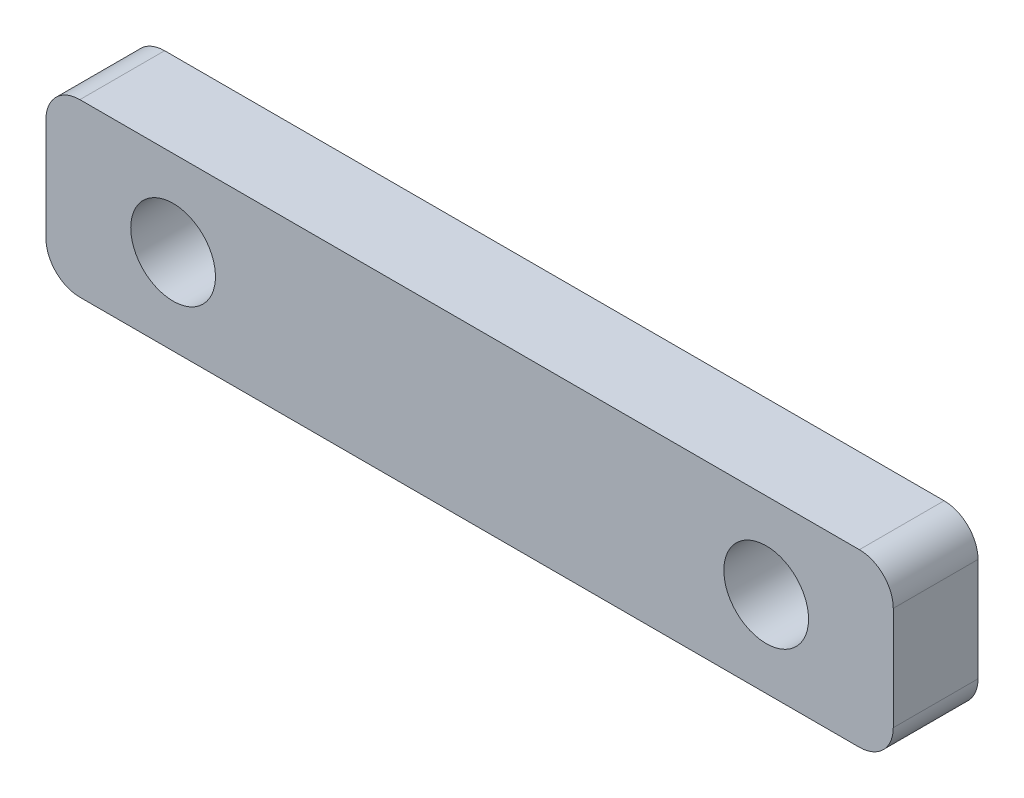
ISO-10303-21;
HEADER;
FILE_DESCRIPTION(('STEP AP214'),'2;1');
FILE_NAME('part.step','',(''),(''),'','','');
FILE_SCHEMA(('AUTOMOTIVE_DESIGN { 1 0 10303 214 1 1 1 1 }'));
ENDSEC;
DATA;
#1=APPLICATION_CONTEXT('core data for automotive mechanical design processes');
#2=APPLICATION_PROTOCOL_DEFINITION('international standard','automotive_design',2000,#1);
#3=PRODUCT_CONTEXT('',#1,'mechanical');
#4=PRODUCT('Part','Part','',(#3));
#5=PRODUCT_RELATED_PRODUCT_CATEGORY('part','',(#4));
#6=PRODUCT_DEFINITION_FORMATION('','',#4);
#7=PRODUCT_DEFINITION_CONTEXT('part definition',#1,'design');
#8=PRODUCT_DEFINITION('design','',#6,#7);
#9=PRODUCT_DEFINITION_SHAPE('','',#8);
#10=(LENGTH_UNIT() NAMED_UNIT(*) SI_UNIT(.MILLI.,.METRE.));
#11=(NAMED_UNIT(*) PLANE_ANGLE_UNIT() SI_UNIT($,.RADIAN.));
#12=(NAMED_UNIT(*) SI_UNIT($,.STERADIAN.) SOLID_ANGLE_UNIT());
#13=UNCERTAINTY_MEASURE_WITH_UNIT(LENGTH_MEASURE(1.E-05),#10,'distance_accuracy_value','');
#14=(GEOMETRIC_REPRESENTATION_CONTEXT(3) GLOBAL_UNCERTAINTY_ASSIGNED_CONTEXT((#13)) GLOBAL_UNIT_ASSIGNED_CONTEXT((#10,
#11,#12)) REPRESENTATION_CONTEXT('',''));
#15=CARTESIAN_POINT('',(0.,0.,0.));
#16=DIRECTION('',(0.,0.,1.));
#17=DIRECTION('',(1.,0.,0.));
#18=AXIS2_PLACEMENT_3D('',#15,#16,#17);
#19=CARTESIAN_POINT('',(34.5443338450992,5.89447236180904,5.));
#20=DIRECTION('',(0.,0.,1.));
#21=DIRECTION('',(1.,0.,0.));
#22=AXIS2_PLACEMENT_3D('',#19,#20,#21);
#23=PLANE('',#22);
#24=CARTESIAN_POINT('',(29.0443338450992,8.94447236180905,5.));
#25=DIRECTION('',(0.,0.,1.));
#26=DIRECTION('',(1.,0.,0.));
#27=AXIS2_PLACEMENT_3D('',#24,#25,#26);
#28=CIRCLE('',#27,2.5);
#29=CARTESIAN_POINT('',(31.5443338450992,8.94447236180905,5.));
#30=VERTEX_POINT('',#29);
#31=EDGE_CURVE('E140',#30,#30,#28,.T.);
#32=ORIENTED_EDGE('',*,*,#31,.F.);
#33=EDGE_LOOP('',(#32));
#34=FACE_BOUND('',#33,.T.);
#35=CARTESIAN_POINT('',(34.5443338450992,5.89447236180904,5.));
#36=DIRECTION('',(0.,0.,1.));
#37=DIRECTION('',(1.,0.,0.));
#38=AXIS2_PLACEMENT_3D('',#35,#36,#37);
#39=CIRCLE('',#38,2.);
#40=CARTESIAN_POINT('',(34.5443338450992,3.89447236180904,5.));
#41=VERTEX_POINT('',#40);
#42=CARTESIAN_POINT('',(36.5443338450992,5.89447236180906,5.));
#43=VERTEX_POINT('',#42);
#44=EDGE_CURVE('E151',#41,#43,#39,.T.);
#45=ORIENTED_EDGE('',*,*,#44,.T.);
#46=DIRECTION('',(0.,1.,0.));
#47=VECTOR('',#46,1.);
#48=CARTESIAN_POINT('',(36.5443338450992,11.994472361809,5.));
#49=LINE('',#48,#47);
#50=CARTESIAN_POINT('',(36.5443338450992,11.994472361809,5.));
#51=VERTEX_POINT('',#50);
#52=EDGE_CURVE('E99',#43,#51,#49,.T.);
#53=ORIENTED_EDGE('',*,*,#52,.T.);
#54=CARTESIAN_POINT('',(34.5443338450992,11.994472361809,5.));
#55=DIRECTION('',(0.,0.,1.));
#56=DIRECTION('',(1.,0.,0.));
#57=AXIS2_PLACEMENT_3D('',#54,#55,#56);
#58=CIRCLE('',#57,2.);
#59=CARTESIAN_POINT('',(34.5443338450992,13.994472361809,5.));
#60=VERTEX_POINT('',#59);
#61=EDGE_CURVE('E166',#51,#60,#58,.T.);
#62=ORIENTED_EDGE('',*,*,#61,.T.);
#63=DIRECTION('',(-1.,0.,0.));
#64=VECTOR('',#63,1.);
#65=CARTESIAN_POINT('',(-11.4556661549007,13.994472361809,5.));
#66=LINE('',#65,#64);
#67=CARTESIAN_POINT('',(-11.4556661549007,13.994472361809,5.));
#68=VERTEX_POINT('',#67);
#69=EDGE_CURVE('E179',#60,#68,#66,.T.);
#70=ORIENTED_EDGE('',*,*,#69,.T.);
#71=CARTESIAN_POINT('',(-11.4556661549008,11.994472361809,5.));
#72=DIRECTION('',(0.,0.,1.));
#73=DIRECTION('',(-1.,0.,0.));
#74=AXIS2_PLACEMENT_3D('',#71,#72,#73);
#75=CIRCLE('',#74,2.);
#76=CARTESIAN_POINT('',(-13.4556661549008,11.994472361809,5.));
#77=VERTEX_POINT('',#76);
#78=EDGE_CURVE('E118',#68,#77,#75,.T.);
#79=ORIENTED_EDGE('',*,*,#78,.T.);
#80=DIRECTION('',(0.,-1.,0.));
#81=VECTOR('',#80,1.);
#82=CARTESIAN_POINT('',(-13.4556661549008,11.994472361809,5.));
#83=LINE('',#82,#81);
#84=CARTESIAN_POINT('',(-13.4556661549008,5.89447236180904,5.));
#85=VERTEX_POINT('',#84);
#86=EDGE_CURVE('E112',#77,#85,#83,.T.);
#87=ORIENTED_EDGE('',*,*,#86,.T.);
#88=CARTESIAN_POINT('',(-11.4556661549008,5.89447236180904,5.));
#89=DIRECTION('',(0.,0.,1.));
#90=DIRECTION('',(-1.,0.,0.));
#91=AXIS2_PLACEMENT_3D('',#88,#89,#90);
#92=CIRCLE('',#91,2.);
#93=CARTESIAN_POINT('',(-11.4556661549007,3.89447236180904,5.));
#94=VERTEX_POINT('',#93);
#95=EDGE_CURVE('E116',#85,#94,#92,.T.);
#96=ORIENTED_EDGE('',*,*,#95,.T.);
#97=DIRECTION('',(1.,0.,0.));
#98=VECTOR('',#97,1.);
#99=CARTESIAN_POINT('',(-11.4556661549007,3.89447236180904,5.));
#100=LINE('',#99,#98);
#101=EDGE_CURVE('E56',#94,#41,#100,.T.);
#102=ORIENTED_EDGE('',*,*,#101,.T.);
#103=EDGE_LOOP('',(#45,#53,#62,#70,#79,#87,#96,#102));
#104=FACE_BOUND('',#103,.T.);
#105=CARTESIAN_POINT('',(-5.95566615490074,8.94447236180905,5.));
#106=DIRECTION('',(0.,0.,1.));
#107=DIRECTION('',(-1.,0.,0.));
#108=AXIS2_PLACEMENT_3D('',#105,#106,#107);
#109=CIRCLE('',#108,2.5);
#110=CARTESIAN_POINT('',(-8.45566615490075,8.94447236180905,5.));
#111=VERTEX_POINT('',#110);
#112=EDGE_CURVE('E188',#111,#111,#109,.T.);
#113=ORIENTED_EDGE('',*,*,#112,.F.);
#114=EDGE_LOOP('',(#113));
#115=FACE_BOUND('',#114,.T.);
#116=ADVANCED_FACE('F39',(#34,#104,#115),#23,.T.);
#117=CARTESIAN_POINT('',(34.5443338450992,5.89447236180904,0.));
#118=DIRECTION('',(0.,0.,1.));
#119=DIRECTION('',(1.,0.,0.));
#120=AXIS2_PLACEMENT_3D('',#117,#118,#119);
#121=PLANE('',#120);
#122=CARTESIAN_POINT('',(34.5443338450992,5.89447236180904,0.));
#123=DIRECTION('',(0.,0.,1.));
#124=DIRECTION('',(1.,0.,0.));
#125=AXIS2_PLACEMENT_3D('',#122,#123,#124);
#126=CIRCLE('',#125,2.);
#127=CARTESIAN_POINT('',(34.5443338450992,3.89447236180904,0.));
#128=VERTEX_POINT('',#127);
#129=CARTESIAN_POINT('',(36.5443338450992,5.89447236180906,0.));
#130=VERTEX_POINT('',#129);
#131=EDGE_CURVE('E136',#128,#130,#126,.T.);
#132=ORIENTED_EDGE('',*,*,#131,.F.);
#133=DIRECTION('',(1.,0.,0.));
#134=VECTOR('',#133,1.);
#135=CARTESIAN_POINT('',(-11.4556661549007,3.89447236180904,0.));
#136=LINE('',#135,#134);
#137=CARTESIAN_POINT('',(-11.4556661549007,3.89447236180904,0.));
#138=VERTEX_POINT('',#137);
#139=EDGE_CURVE('E91',#138,#128,#136,.T.);
#140=ORIENTED_EDGE('',*,*,#139,.F.);
#141=CARTESIAN_POINT('',(-11.4556661549008,5.89447236180904,0.));
#142=DIRECTION('',(0.,0.,1.));
#143=DIRECTION('',(-1.,0.,0.));
#144=AXIS2_PLACEMENT_3D('',#141,#142,#143);
#145=CIRCLE('',#144,2.);
#146=CARTESIAN_POINT('',(-13.4556661549008,5.89447236180904,0.));
#147=VERTEX_POINT('',#146);
#148=EDGE_CURVE('E85',#147,#138,#145,.T.);
#149=ORIENTED_EDGE('',*,*,#148,.F.);
#150=DIRECTION('',(0.,-1.,0.));
#151=VECTOR('',#150,1.);
#152=CARTESIAN_POINT('',(-13.4556661549008,11.994472361809,0.));
#153=LINE('',#152,#151);
#154=CARTESIAN_POINT('',(-13.4556661549008,11.994472361809,0.));
#155=VERTEX_POINT('',#154);
#156=EDGE_CURVE('E126',#155,#147,#153,.T.);
#157=ORIENTED_EDGE('',*,*,#156,.F.);
#158=CARTESIAN_POINT('',(-11.4556661549008,11.994472361809,0.));
#159=DIRECTION('',(0.,0.,1.));
#160=DIRECTION('',(-1.,0.,0.));
#161=AXIS2_PLACEMENT_3D('',#158,#159,#160);
#162=CIRCLE('',#161,2.);
#163=CARTESIAN_POINT('',(-11.4556661549007,13.994472361809,0.));
#164=VERTEX_POINT('',#163);
#165=EDGE_CURVE('E146',#164,#155,#162,.T.);
#166=ORIENTED_EDGE('',*,*,#165,.F.);
#167=DIRECTION('',(-1.,0.,0.));
#168=VECTOR('',#167,1.);
#169=CARTESIAN_POINT('',(-11.4556661549007,13.994472361809,0.));
#170=LINE('',#169,#168);
#171=CARTESIAN_POINT('',(34.5443338450992,13.994472361809,0.));
#172=VERTEX_POINT('',#171);
#173=EDGE_CURVE('E144',#172,#164,#170,.T.);
#174=ORIENTED_EDGE('',*,*,#173,.F.);
#175=CARTESIAN_POINT('',(34.5443338450992,11.994472361809,0.));
#176=DIRECTION('',(0.,0.,1.));
#177=DIRECTION('',(1.,0.,0.));
#178=AXIS2_PLACEMENT_3D('',#175,#176,#177);
#179=CIRCLE('',#178,2.);
#180=CARTESIAN_POINT('',(36.5443338450992,11.994472361809,0.));
#181=VERTEX_POINT('',#180);
#182=EDGE_CURVE('E142',#181,#172,#179,.T.);
#183=ORIENTED_EDGE('',*,*,#182,.F.);
#184=DIRECTION('',(0.,1.,0.));
#185=VECTOR('',#184,1.);
#186=CARTESIAN_POINT('',(36.5443338450992,11.994472361809,0.));
#187=LINE('',#186,#185);
#188=EDGE_CURVE('E139',#130,#181,#187,.T.);
#189=ORIENTED_EDGE('',*,*,#188,.F.);
#190=EDGE_LOOP('',(#132,#140,#149,#157,#166,#174,#183,#189));
#191=FACE_BOUND('',#190,.T.);
#192=CARTESIAN_POINT('',(29.0443338450992,8.94447236180905,0.));
#193=DIRECTION('',(0.,0.,1.));
#194=DIRECTION('',(1.,0.,0.));
#195=AXIS2_PLACEMENT_3D('',#192,#193,#194);
#196=CIRCLE('',#195,2.5);
#197=CARTESIAN_POINT('',(31.5443338450992,8.94447236180905,0.));
#198=VERTEX_POINT('',#197);
#199=EDGE_CURVE('E185',#198,#198,#196,.T.);
#200=ORIENTED_EDGE('',*,*,#199,.T.);
#201=EDGE_LOOP('',(#200));
#202=FACE_BOUND('',#201,.T.);
#203=CARTESIAN_POINT('',(-5.95566615490074,8.94447236180905,0.));
#204=DIRECTION('',(0.,0.,1.));
#205=DIRECTION('',(-1.,0.,0.));
#206=AXIS2_PLACEMENT_3D('',#203,#204,#205);
#207=CIRCLE('',#206,2.5);
#208=CARTESIAN_POINT('',(-8.45566615490075,8.94447236180905,0.));
#209=VERTEX_POINT('',#208);
#210=EDGE_CURVE('E191',#209,#209,#207,.T.);
#211=ORIENTED_EDGE('',*,*,#210,.T.);
#212=EDGE_LOOP('',(#211));
#213=FACE_BOUND('',#212,.T.);
#214=ADVANCED_FACE('F170',(#191,#202,#213),#121,.F.);
#215=CARTESIAN_POINT('',(34.5443338450992,5.89447236180904,5.));
#216=DIRECTION('',(0.,0.,-1.));
#217=DIRECTION('',(-1.,0.,0.));
#218=AXIS2_PLACEMENT_3D('',#215,#216,#217);
#219=CYLINDRICAL_SURFACE('',#218,2.);
#220=ORIENTED_EDGE('',*,*,#131,.T.);
#221=DIRECTION('',(0.,0.,-1.));
#222=VECTOR('',#221,1.);
#223=CARTESIAN_POINT('',(36.5443338450992,5.89447236180906,5.));
#224=LINE('',#223,#222);
#225=EDGE_CURVE('E11',#43,#130,#224,.T.);
#226=ORIENTED_EDGE('',*,*,#225,.F.);
#227=ORIENTED_EDGE('',*,*,#44,.F.);
#228=DIRECTION('',(0.,0.,-1.));
#229=VECTOR('',#228,1.);
#230=CARTESIAN_POINT('',(34.5443338450992,3.89447236180904,5.));
#231=LINE('',#230,#229);
#232=EDGE_CURVE('E132',#41,#128,#231,.T.);
#233=ORIENTED_EDGE('',*,*,#232,.T.);
#234=EDGE_LOOP('',(#220,#226,#227,#233));
#235=FACE_BOUND('',#234,.T.);
#236=ADVANCED_FACE('F41',(#235),#219,.T.);
#237=CARTESIAN_POINT('',(36.5443338450992,11.994472361809,5.));
#238=DIRECTION('',(-1.,0.,0.));
#239=DIRECTION('',(0.,-1.,0.));
#240=AXIS2_PLACEMENT_3D('',#237,#238,#239);
#241=PLANE('',#240);
#242=ORIENTED_EDGE('',*,*,#188,.T.);
#243=DIRECTION('',(0.,0.,-1.));
#244=VECTOR('',#243,1.);
#245=CARTESIAN_POINT('',(36.5443338450992,11.994472361809,5.));
#246=LINE('',#245,#244);
#247=EDGE_CURVE('E48',#51,#181,#246,.T.);
#248=ORIENTED_EDGE('',*,*,#247,.F.);
#249=ORIENTED_EDGE('',*,*,#52,.F.);
#250=ORIENTED_EDGE('',*,*,#225,.T.);
#251=EDGE_LOOP('',(#242,#248,#249,#250));
#252=FACE_BOUND('',#251,.T.);
#253=ADVANCED_FACE('F223',(#252),#241,.F.);
#254=CARTESIAN_POINT('',(34.5443338450992,11.994472361809,5.));
#255=DIRECTION('',(0.,0.,-1.));
#256=DIRECTION('',(-1.,0.,0.));
#257=AXIS2_PLACEMENT_3D('',#254,#255,#256);
#258=CYLINDRICAL_SURFACE('',#257,2.);
#259=ORIENTED_EDGE('',*,*,#182,.T.);
#260=DIRECTION('',(0.,0.,-1.));
#261=VECTOR('',#260,1.);
#262=CARTESIAN_POINT('',(34.5443338450992,13.994472361809,5.));
#263=LINE('',#262,#261);
#264=EDGE_CURVE('E158',#60,#172,#263,.T.);
#265=ORIENTED_EDGE('',*,*,#264,.F.);
#266=ORIENTED_EDGE('',*,*,#61,.F.);
#267=ORIENTED_EDGE('',*,*,#247,.T.);
#268=EDGE_LOOP('',(#259,#265,#266,#267));
#269=FACE_BOUND('',#268,.T.);
#270=ADVANCED_FACE('F164',(#269),#258,.T.);
#271=CARTESIAN_POINT('',(-11.4556661549007,13.994472361809,5.));
#272=DIRECTION('',(0.,-1.,0.));
#273=DIRECTION('',(1.,0.,0.));
#274=AXIS2_PLACEMENT_3D('',#271,#272,#273);
#275=PLANE('',#274);
#276=ORIENTED_EDGE('',*,*,#173,.T.);
#277=DIRECTION('',(0.,0.,-1.));
#278=VECTOR('',#277,1.);
#279=CARTESIAN_POINT('',(-11.4556661549007,13.994472361809,5.));
#280=LINE('',#279,#278);
#281=EDGE_CURVE('E155',#68,#164,#280,.T.);
#282=ORIENTED_EDGE('',*,*,#281,.F.);
#283=ORIENTED_EDGE('',*,*,#69,.F.);
#284=ORIENTED_EDGE('',*,*,#264,.T.);
#285=EDGE_LOOP('',(#276,#282,#283,#284));
#286=FACE_BOUND('',#285,.T.);
#287=ADVANCED_FACE('F175',(#286),#275,.F.);
#288=CARTESIAN_POINT('',(-11.4556661549008,11.994472361809,5.));
#289=DIRECTION('',(0.,0.,-1.));
#290=DIRECTION('',(-1.,0.,0.));
#291=AXIS2_PLACEMENT_3D('',#288,#289,#290);
#292=CYLINDRICAL_SURFACE('',#291,2.);
#293=ORIENTED_EDGE('',*,*,#165,.T.);
#294=DIRECTION('',(0.,0.,-1.));
#295=VECTOR('',#294,1.);
#296=CARTESIAN_POINT('',(-13.4556661549008,11.994472361809,5.));
#297=LINE('',#296,#295);
#298=EDGE_CURVE('E127',#77,#155,#297,.T.);
#299=ORIENTED_EDGE('',*,*,#298,.F.);
#300=ORIENTED_EDGE('',*,*,#78,.F.);
#301=ORIENTED_EDGE('',*,*,#281,.T.);
#302=EDGE_LOOP('',(#293,#299,#300,#301));
#303=FACE_BOUND('',#302,.T.);
#304=ADVANCED_FACE('F178',(#303),#292,.T.);
#305=CARTESIAN_POINT('',(-13.4556661549008,11.994472361809,5.));
#306=DIRECTION('',(1.,0.,0.));
#307=DIRECTION('',(0.,1.,0.));
#308=AXIS2_PLACEMENT_3D('',#305,#306,#307);
#309=PLANE('',#308);
#310=ORIENTED_EDGE('',*,*,#156,.T.);
#311=DIRECTION('',(0.,0.,-1.));
#312=VECTOR('',#311,1.);
#313=CARTESIAN_POINT('',(-13.4556661549008,5.89447236180904,5.));
#314=LINE('',#313,#312);
#315=EDGE_CURVE('E123',#85,#147,#314,.T.);
#316=ORIENTED_EDGE('',*,*,#315,.F.);
#317=ORIENTED_EDGE('',*,*,#86,.F.);
#318=ORIENTED_EDGE('',*,*,#298,.T.);
#319=EDGE_LOOP('',(#310,#316,#317,#318));
#320=FACE_BOUND('',#319,.T.);
#321=ADVANCED_FACE('F124',(#320),#309,.F.);
#322=CARTESIAN_POINT('',(-11.4556661549008,5.89447236180904,5.));
#323=DIRECTION('',(0.,0.,-1.));
#324=DIRECTION('',(-1.,0.,0.));
#325=AXIS2_PLACEMENT_3D('',#322,#323,#324);
#326=CYLINDRICAL_SURFACE('',#325,2.);
#327=ORIENTED_EDGE('',*,*,#148,.T.);
#328=DIRECTION('',(0.,0.,-1.));
#329=VECTOR('',#328,1.);
#330=CARTESIAN_POINT('',(-11.4556661549007,3.89447236180904,5.));
#331=LINE('',#330,#329);
#332=EDGE_CURVE('E128',#94,#138,#331,.T.);
#333=ORIENTED_EDGE('',*,*,#332,.F.);
#334=ORIENTED_EDGE('',*,*,#95,.F.);
#335=ORIENTED_EDGE('',*,*,#315,.T.);
#336=EDGE_LOOP('',(#327,#333,#334,#335));
#337=FACE_BOUND('',#336,.T.);
#338=ADVANCED_FACE('F130',(#337),#326,.T.);
#339=CARTESIAN_POINT('',(-11.4556661549007,3.89447236180904,5.));
#340=DIRECTION('',(0.,1.,0.));
#341=DIRECTION('',(0.,0.,1.));
#342=AXIS2_PLACEMENT_3D('',#339,#340,#341);
#343=PLANE('',#342);
#344=ORIENTED_EDGE('',*,*,#139,.T.);
#345=ORIENTED_EDGE('',*,*,#232,.F.);
#346=ORIENTED_EDGE('',*,*,#101,.F.);
#347=ORIENTED_EDGE('',*,*,#332,.T.);
#348=EDGE_LOOP('',(#344,#345,#346,#347));
#349=FACE_BOUND('',#348,.T.);
#350=ADVANCED_FACE('F211',(#349),#343,.F.);
#351=CARTESIAN_POINT('',(29.0443338450992,8.94447236180905,5.));
#352=DIRECTION('',(0.,0.,-1.));
#353=DIRECTION('',(-1.,0.,0.));
#354=AXIS2_PLACEMENT_3D('',#351,#352,#353);
#355=CYLINDRICAL_SURFACE('',#354,2.5);
#356=ORIENTED_EDGE('',*,*,#31,.T.);
#357=EDGE_LOOP('',(#356));
#358=FACE_BOUND('',#357,.T.);
#359=ORIENTED_EDGE('',*,*,#199,.F.);
#360=EDGE_LOOP('',(#359));
#361=FACE_BOUND('',#360,.T.);
#362=ADVANCED_FACE('F208',(#358,#361),#355,.F.);
#363=CARTESIAN_POINT('',(-5.95566615490074,8.94447236180905,5.));
#364=DIRECTION('',(0.,0.,-1.));
#365=DIRECTION('',(-1.,0.,0.));
#366=AXIS2_PLACEMENT_3D('',#363,#364,#365);
#367=CYLINDRICAL_SURFACE('',#366,2.5);
#368=ORIENTED_EDGE('',*,*,#112,.T.);
#369=EDGE_LOOP('',(#368));
#370=FACE_BOUND('',#369,.T.);
#371=ORIENTED_EDGE('',*,*,#210,.F.);
#372=EDGE_LOOP('',(#371));
#373=FACE_BOUND('',#372,.T.);
#374=ADVANCED_FACE('F197',(#370,#373),#367,.F.);
#375=CLOSED_SHELL('',(#116,#214,#236,#253,#270,#287,#304,#321,#338,#350,#362,#374));
#376=MANIFOLD_SOLID_BREP('B2',#375);
#377=ADVANCED_BREP_SHAPE_REPRESENTATION('',(#18,#376),#14);
#378=SHAPE_DEFINITION_REPRESENTATION(#9,#377);
ENDSEC;
END-ISO-10303-21;
